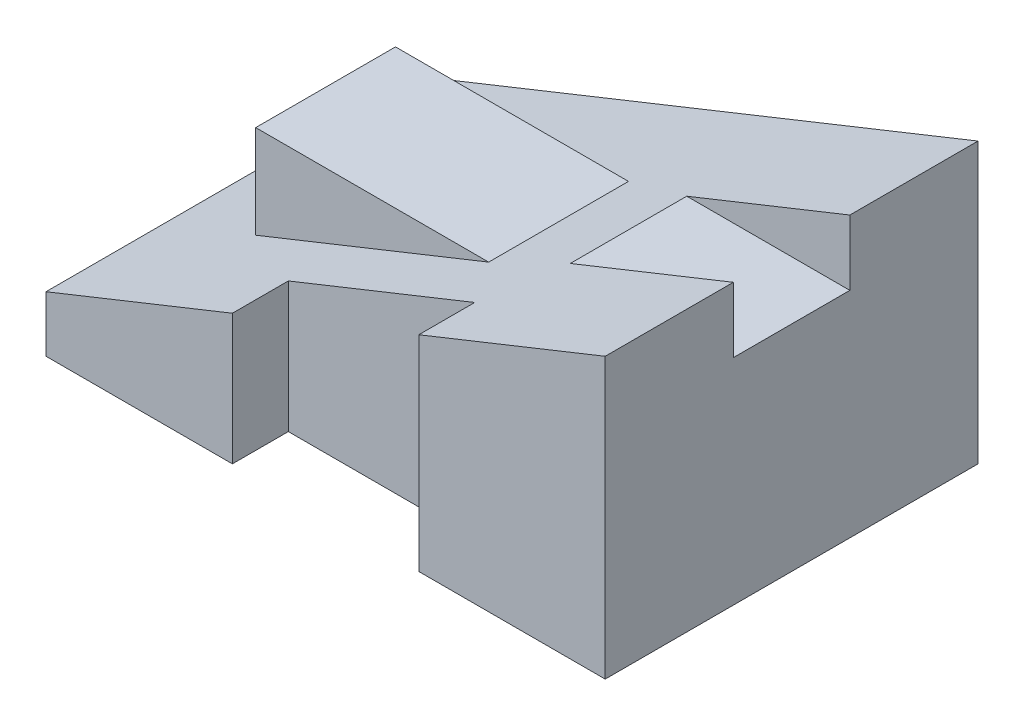
ISO-10303-21;
HEADER;
FILE_DESCRIPTION(('STEP AP214'),'2;1');
FILE_NAME('part.step','',(''),(''),'','','');
FILE_SCHEMA(('AUTOMOTIVE_DESIGN { 1 0 10303 214 1 1 1 1 }'));
ENDSEC;
DATA;
#1=APPLICATION_CONTEXT('core data for automotive mechanical design processes');
#2=APPLICATION_PROTOCOL_DEFINITION('international standard','automotive_design',2000,#1);
#3=PRODUCT_CONTEXT('',#1,'mechanical');
#4=PRODUCT('Part','Part','',(#3));
#5=PRODUCT_RELATED_PRODUCT_CATEGORY('part','',(#4));
#6=PRODUCT_DEFINITION_FORMATION('','',#4);
#7=PRODUCT_DEFINITION_CONTEXT('part definition',#1,'design');
#8=PRODUCT_DEFINITION('design','',#6,#7);
#9=PRODUCT_DEFINITION_SHAPE('','',#8);
#10=(LENGTH_UNIT() NAMED_UNIT(*) SI_UNIT(.MILLI.,.METRE.));
#11=(NAMED_UNIT(*) PLANE_ANGLE_UNIT() SI_UNIT($,.RADIAN.));
#12=(NAMED_UNIT(*) SI_UNIT($,.STERADIAN.) SOLID_ANGLE_UNIT());
#13=UNCERTAINTY_MEASURE_WITH_UNIT(LENGTH_MEASURE(1.E-05),#10,'distance_accuracy_value','');
#14=(GEOMETRIC_REPRESENTATION_CONTEXT(3) GLOBAL_UNCERTAINTY_ASSIGNED_CONTEXT((#13)) GLOBAL_UNIT_ASSIGNED_CONTEXT((#10,
#11,#12)) REPRESENTATION_CONTEXT('',''));
#15=CARTESIAN_POINT('',(0.,0.,0.));
#16=DIRECTION('',(0.,0.,1.));
#17=DIRECTION('',(1.,0.,0.));
#18=AXIS2_PLACEMENT_3D('',#15,#16,#17);
#19=CARTESIAN_POINT('',(60.,60.,-40.));
#20=DIRECTION('',(0.371390676354104,-0.928476690885259,0.));
#21=DIRECTION('',(0.928476690885259,0.371390676354104,0.));
#22=AXIS2_PLACEMENT_3D('',#19,#20,#21);
#23=PLANE('',#22);
#24=DIRECTION('',(0.,0.,1.));
#25=VECTOR('',#24,1.);
#26=CARTESIAN_POINT('',(-40.,20.,-40.));
#27=LINE('',#26,#25);
#28=CARTESIAN_POINT('',(-40.,20.,-15.));
#29=VERTEX_POINT('',#28);
#30=CARTESIAN_POINT('',(-40.,20.,15.));
#31=VERTEX_POINT('',#30);
#32=EDGE_CURVE('E245',#29,#31,#27,.T.);
#33=ORIENTED_EDGE('',*,*,#32,.F.);
#34=DIRECTION('',(-0.928476690885259,-0.371390676354104,0.));
#35=VECTOR('',#34,1.);
#36=CARTESIAN_POINT('',(60.,60.,-15.));
#37=LINE('',#36,#35);
#38=CARTESIAN_POINT('',(9.99999999999999,40.,-15.));
#39=VERTEX_POINT('',#38);
#40=EDGE_CURVE('E236',#39,#29,#37,.T.);
#41=ORIENTED_EDGE('',*,*,#40,.F.);
#42=DIRECTION('',(0.,0.,1.));
#43=VECTOR('',#42,1.);
#44=CARTESIAN_POINT('',(9.99999999999999,40.,-40.));
#45=LINE('',#44,#43);
#46=CARTESIAN_POINT('',(9.99999999999999,40.,15.));
#47=VERTEX_POINT('',#46);
#48=EDGE_CURVE('E231',#39,#47,#45,.T.);
#49=ORIENTED_EDGE('',*,*,#48,.T.);
#50=DIRECTION('',(0.928476690885259,0.371390676354104,0.));
#51=VECTOR('',#50,1.);
#52=CARTESIAN_POINT('',(60.,60.,15.));
#53=LINE('',#52,#51);
#54=EDGE_CURVE('E238',#31,#47,#53,.T.);
#55=ORIENTED_EDGE('',*,*,#54,.F.);
#56=EDGE_LOOP('',(#33,#41,#49,#55));
#57=FACE_BOUND('',#56,.T.);
#58=DIRECTION('',(0.928476690885259,0.371390676354104,0.));
#59=VECTOR('',#58,1.);
#60=CARTESIAN_POINT('',(60.,60.,12.5));
#61=LINE('',#60,#59);
#62=CARTESIAN_POINT('',(25.,46.,12.5));
#63=VERTEX_POINT('',#62);
#64=CARTESIAN_POINT('',(60.,60.,12.5));
#65=VERTEX_POINT('',#64);
#66=EDGE_CURVE('E11',#63,#65,#61,.T.);
#67=ORIENTED_EDGE('',*,*,#66,.F.);
#68=DIRECTION('',(0.,0.,1.));
#69=VECTOR('',#68,1.);
#70=CARTESIAN_POINT('',(24.9999999999999,46.,-39.9999999999999));
#71=LINE('',#70,#69);
#72=CARTESIAN_POINT('',(25.,46.,-12.5));
#73=VERTEX_POINT('',#72);
#74=EDGE_CURVE('E161',#73,#63,#71,.T.);
#75=ORIENTED_EDGE('',*,*,#74,.F.);
#76=DIRECTION('',(-0.928476690885259,-0.371390676354104,0.));
#77=VECTOR('',#76,1.);
#78=CARTESIAN_POINT('',(60.,60.,-12.5));
#79=LINE('',#78,#77);
#80=CARTESIAN_POINT('',(60.,60.,-12.5));
#81=VERTEX_POINT('',#80);
#82=EDGE_CURVE('E50',#81,#73,#79,.T.);
#83=ORIENTED_EDGE('',*,*,#82,.F.);
#84=DIRECTION('',(0.,0.,-1.));
#85=VECTOR('',#84,1.);
#86=CARTESIAN_POINT('',(60.,60.,-40.));
#87=LINE('',#86,#85);
#88=CARTESIAN_POINT('',(60.,60.,-40.));
#89=VERTEX_POINT('',#88);
#90=EDGE_CURVE('E156',#81,#89,#87,.T.);
#91=ORIENTED_EDGE('',*,*,#90,.T.);
#92=DIRECTION('',(0.92847669088526,0.371390676354104,0.));
#93=VECTOR('',#92,1.);
#94=CARTESIAN_POINT('',(60.,60.,-40.));
#95=LINE('',#94,#93);
#96=CARTESIAN_POINT('',(-60.,12.,-40.));
#97=VERTEX_POINT('',#96);
#98=EDGE_CURVE('E173',#97,#89,#95,.T.);
#99=ORIENTED_EDGE('',*,*,#98,.F.);
#100=DIRECTION('',(0.,0.,1.));
#101=VECTOR('',#100,1.);
#102=CARTESIAN_POINT('',(-60.,12.,-40.));
#103=LINE('',#102,#101);
#104=CARTESIAN_POINT('',(-60.,12.,40.));
#105=VERTEX_POINT('',#104);
#106=EDGE_CURVE('E178',#97,#105,#103,.T.);
#107=ORIENTED_EDGE('',*,*,#106,.T.);
#108=DIRECTION('',(0.92847669088526,0.371390676354104,0.));
#109=VECTOR('',#108,1.);
#110=CARTESIAN_POINT('',(60.,60.,40.));
#111=LINE('',#110,#109);
#112=CARTESIAN_POINT('',(-20.,28.,40.));
#113=VERTEX_POINT('',#112);
#114=EDGE_CURVE('E179',#105,#113,#111,.T.);
#115=ORIENTED_EDGE('',*,*,#114,.T.);
#116=DIRECTION('',(0.,0.,1.));
#117=VECTOR('',#116,1.);
#118=CARTESIAN_POINT('',(-20.,28.,28.));
#119=LINE('',#118,#117);
#120=CARTESIAN_POINT('',(-20.,28.,28.));
#121=VERTEX_POINT('',#120);
#122=EDGE_CURVE('E183',#121,#113,#119,.T.);
#123=ORIENTED_EDGE('',*,*,#122,.F.);
#124=DIRECTION('',(-0.928476690885259,-0.371390676354104,0.));
#125=VECTOR('',#124,1.);
#126=CARTESIAN_POINT('',(-8.96551724137929,32.4137931034483,28.));
#127=LINE('',#126,#125);
#128=CARTESIAN_POINT('',(20.,44.,28.));
#129=VERTEX_POINT('',#128);
#130=EDGE_CURVE('E185',#129,#121,#127,.T.);
#131=ORIENTED_EDGE('',*,*,#130,.F.);
#132=DIRECTION('',(0.,0.,-1.));
#133=VECTOR('',#132,1.);
#134=CARTESIAN_POINT('',(20.,44.,28.));
#135=LINE('',#134,#133);
#136=CARTESIAN_POINT('',(20.,44.,40.));
#137=VERTEX_POINT('',#136);
#138=EDGE_CURVE('E235',#137,#129,#135,.T.);
#139=ORIENTED_EDGE('',*,*,#138,.F.);
#140=CARTESIAN_POINT('',(60.,60.,40.));
#141=VERTEX_POINT('',#140);
#142=EDGE_CURVE('E171',#137,#141,#111,.T.);
#143=ORIENTED_EDGE('',*,*,#142,.T.);
#144=EDGE_CURVE('E186',#141,#65,#87,.T.);
#145=ORIENTED_EDGE('',*,*,#144,.T.);
#146=EDGE_LOOP('',(#67,#75,#83,#91,#99,#107,#115,#123,#131,#139,#143,#145));
#147=FACE_BOUND('',#146,.T.);
#148=ADVANCED_FACE('F39',(#57,#147),#23,.F.);
#149=CARTESIAN_POINT('',(60.,60.,-40.));
#150=DIRECTION('',(-1.,0.,0.));
#151=DIRECTION('',(0.,0.,1.));
#152=AXIS2_PLACEMENT_3D('',#149,#150,#151);
#153=PLANE('',#152);
#154=DIRECTION('',(0.,-1.,0.));
#155=VECTOR('',#154,1.);
#156=CARTESIAN_POINT('',(60.,60.,12.5));
#157=LINE('',#156,#155);
#158=CARTESIAN_POINT('',(60.,46.,12.5));
#159=VERTEX_POINT('',#158);
#160=EDGE_CURVE('E150',#65,#159,#157,.T.);
#161=ORIENTED_EDGE('',*,*,#160,.F.);
#162=ORIENTED_EDGE('',*,*,#144,.F.);
#163=DIRECTION('',(0.,-1.,0.));
#164=VECTOR('',#163,1.);
#165=CARTESIAN_POINT('',(60.,60.,40.));
#166=LINE('',#165,#164);
#167=CARTESIAN_POINT('',(60.,0.,40.));
#168=VERTEX_POINT('',#167);
#169=EDGE_CURVE('E226',#141,#168,#166,.T.);
#170=ORIENTED_EDGE('',*,*,#169,.T.);
#171=DIRECTION('',(0.,0.,-1.));
#172=VECTOR('',#171,1.);
#173=CARTESIAN_POINT('',(60.,0.,-40.));
#174=LINE('',#173,#172);
#175=CARTESIAN_POINT('',(60.,0.,-40.));
#176=VERTEX_POINT('',#175);
#177=EDGE_CURVE('E191',#168,#176,#174,.T.);
#178=ORIENTED_EDGE('',*,*,#177,.T.);
#179=DIRECTION('',(0.,-1.,0.));
#180=VECTOR('',#179,1.);
#181=CARTESIAN_POINT('',(60.,60.,-40.));
#182=LINE('',#181,#180);
#183=EDGE_CURVE('E227',#89,#176,#182,.T.);
#184=ORIENTED_EDGE('',*,*,#183,.F.);
#185=ORIENTED_EDGE('',*,*,#90,.F.);
#186=DIRECTION('',(0.,1.,0.));
#187=VECTOR('',#186,1.);
#188=CARTESIAN_POINT('',(60.,60.,-12.5));
#189=LINE('',#188,#187);
#190=CARTESIAN_POINT('',(60.,46.,-12.5));
#191=VERTEX_POINT('',#190);
#192=EDGE_CURVE('E148',#191,#81,#189,.T.);
#193=ORIENTED_EDGE('',*,*,#192,.F.);
#194=DIRECTION('',(0.,0.,-1.));
#195=VECTOR('',#194,1.);
#196=CARTESIAN_POINT('',(60.,46.,-12.5));
#197=LINE('',#196,#195);
#198=EDGE_CURVE('E138',#159,#191,#197,.T.);
#199=ORIENTED_EDGE('',*,*,#198,.F.);
#200=EDGE_LOOP('',(#161,#162,#170,#178,#184,#185,#193,#199));
#201=FACE_BOUND('',#200,.T.);
#202=ADVANCED_FACE('F152',(#201),#153,.F.);
#203=CARTESIAN_POINT('',(20.,60.,40.));
#204=DIRECTION('',(0.,0.,-1.));
#205=DIRECTION('',(-1.,0.,0.));
#206=AXIS2_PLACEMENT_3D('',#203,#204,#205);
#207=PLANE('',#206);
#208=ORIENTED_EDGE('',*,*,#142,.F.);
#209=DIRECTION('',(0.,-1.,0.));
#210=VECTOR('',#209,1.);
#211=CARTESIAN_POINT('',(20.,60.,40.));
#212=LINE('',#211,#210);
#213=CARTESIAN_POINT('',(20.,0.,40.));
#214=VERTEX_POINT('',#213);
#215=EDGE_CURVE('E195',#137,#214,#212,.T.);
#216=ORIENTED_EDGE('',*,*,#215,.T.);
#217=DIRECTION('',(1.,0.,0.));
#218=VECTOR('',#217,1.);
#219=CARTESIAN_POINT('',(20.,0.,40.));
#220=LINE('',#219,#218);
#221=EDGE_CURVE('E189',#214,#168,#220,.T.);
#222=ORIENTED_EDGE('',*,*,#221,.T.);
#223=ORIENTED_EDGE('',*,*,#169,.F.);
#224=EDGE_LOOP('',(#208,#216,#222,#223));
#225=FACE_BOUND('',#224,.T.);
#226=ADVANCED_FACE('F41',(#225),#207,.F.);
#227=CARTESIAN_POINT('',(-60.,60.,-40.));
#228=DIRECTION('',(1.,0.,0.));
#229=DIRECTION('',(0.,0.,-1.));
#230=AXIS2_PLACEMENT_3D('',#227,#228,#229);
#231=PLANE('',#230);
#232=ORIENTED_EDGE('',*,*,#106,.F.);
#233=DIRECTION('',(0.,-1.,0.));
#234=VECTOR('',#233,1.);
#235=CARTESIAN_POINT('',(-60.,60.,-40.));
#236=LINE('',#235,#234);
#237=CARTESIAN_POINT('',(-60.,0.,-40.));
#238=VERTEX_POINT('',#237);
#239=EDGE_CURVE('E221',#97,#238,#236,.T.);
#240=ORIENTED_EDGE('',*,*,#239,.T.);
#241=DIRECTION('',(0.,0.,1.));
#242=VECTOR('',#241,1.);
#243=CARTESIAN_POINT('',(-60.,0.,-40.));
#244=LINE('',#243,#242);
#245=CARTESIAN_POINT('',(-60.,0.,40.));
#246=VERTEX_POINT('',#245);
#247=EDGE_CURVE('E199',#238,#246,#244,.T.);
#248=ORIENTED_EDGE('',*,*,#247,.T.);
#249=DIRECTION('',(0.,-1.,0.));
#250=VECTOR('',#249,1.);
#251=CARTESIAN_POINT('',(-60.,60.,40.));
#252=LINE('',#251,#250);
#253=EDGE_CURVE('E225',#105,#246,#252,.T.);
#254=ORIENTED_EDGE('',*,*,#253,.F.);
#255=EDGE_LOOP('',(#232,#240,#248,#254));
#256=FACE_BOUND('',#255,.T.);
#257=ADVANCED_FACE('F293',(#256),#231,.F.);
#258=CARTESIAN_POINT('',(-60.,60.,40.));
#259=DIRECTION('',(0.,0.,-1.));
#260=DIRECTION('',(-1.,0.,0.));
#261=AXIS2_PLACEMENT_3D('',#258,#259,#260);
#262=PLANE('',#261);
#263=ORIENTED_EDGE('',*,*,#114,.F.);
#264=ORIENTED_EDGE('',*,*,#253,.T.);
#265=DIRECTION('',(1.,0.,0.));
#266=VECTOR('',#265,1.);
#267=CARTESIAN_POINT('',(-60.,0.,40.));
#268=LINE('',#267,#266);
#269=CARTESIAN_POINT('',(-20.,0.,40.));
#270=VERTEX_POINT('',#269);
#271=EDGE_CURVE('E201',#246,#270,#268,.T.);
#272=ORIENTED_EDGE('',*,*,#271,.T.);
#273=DIRECTION('',(0.,-1.,0.));
#274=VECTOR('',#273,1.);
#275=CARTESIAN_POINT('',(-20.,60.,40.));
#276=LINE('',#275,#274);
#277=EDGE_CURVE('E219',#113,#270,#276,.T.);
#278=ORIENTED_EDGE('',*,*,#277,.F.);
#279=EDGE_LOOP('',(#263,#264,#272,#278));
#280=FACE_BOUND('',#279,.T.);
#281=ADVANCED_FACE('F295',(#280),#262,.F.);
#282=CARTESIAN_POINT('',(-60.,60.,-40.));
#283=DIRECTION('',(0.,0.,1.));
#284=DIRECTION('',(1.,0.,0.));
#285=AXIS2_PLACEMENT_3D('',#282,#283,#284);
#286=PLANE('',#285);
#287=ORIENTED_EDGE('',*,*,#239,.F.);
#288=ORIENTED_EDGE('',*,*,#98,.T.);
#289=ORIENTED_EDGE('',*,*,#183,.T.);
#290=DIRECTION('',(-1.,0.,0.));
#291=VECTOR('',#290,1.);
#292=CARTESIAN_POINT('',(-60.,0.,-40.));
#293=LINE('',#292,#291);
#294=EDGE_CURVE('E197',#176,#238,#293,.T.);
#295=ORIENTED_EDGE('',*,*,#294,.T.);
#296=EDGE_LOOP('',(#287,#288,#289,#295));
#297=FACE_BOUND('',#296,.T.);
#298=ADVANCED_FACE('F286',(#297),#286,.F.);
#299=CARTESIAN_POINT('',(-20.,60.,28.));
#300=DIRECTION('',(-1.,0.,0.));
#301=DIRECTION('',(0.,0.,1.));
#302=AXIS2_PLACEMENT_3D('',#299,#300,#301);
#303=PLANE('',#302);
#304=DIRECTION('',(0.,-1.,0.));
#305=VECTOR('',#304,1.);
#306=CARTESIAN_POINT('',(-20.,60.,28.));
#307=LINE('',#306,#305);
#308=CARTESIAN_POINT('',(-20.,0.,28.));
#309=VERTEX_POINT('',#308);
#310=EDGE_CURVE('E217',#121,#309,#307,.T.);
#311=ORIENTED_EDGE('',*,*,#310,.F.);
#312=ORIENTED_EDGE('',*,*,#122,.T.);
#313=ORIENTED_EDGE('',*,*,#277,.T.);
#314=DIRECTION('',(0.,0.,-1.));
#315=VECTOR('',#314,1.);
#316=CARTESIAN_POINT('',(-20.,0.,28.));
#317=LINE('',#316,#315);
#318=EDGE_CURVE('E206',#270,#309,#317,.T.);
#319=ORIENTED_EDGE('',*,*,#318,.T.);
#320=EDGE_LOOP('',(#311,#312,#313,#319));
#321=FACE_BOUND('',#320,.T.);
#322=ADVANCED_FACE('F287',(#321),#303,.F.);
#323=CARTESIAN_POINT('',(-20.,60.,28.));
#324=DIRECTION('',(0.,0.,-1.));
#325=DIRECTION('',(-1.,0.,0.));
#326=AXIS2_PLACEMENT_3D('',#323,#324,#325);
#327=PLANE('',#326);
#328=DIRECTION('',(0.,-1.,0.));
#329=VECTOR('',#328,1.);
#330=CARTESIAN_POINT('',(20.,60.,28.));
#331=LINE('',#330,#329);
#332=CARTESIAN_POINT('',(20.,0.,28.));
#333=VERTEX_POINT('',#332);
#334=EDGE_CURVE('E216',#129,#333,#331,.T.);
#335=ORIENTED_EDGE('',*,*,#334,.F.);
#336=ORIENTED_EDGE('',*,*,#130,.T.);
#337=ORIENTED_EDGE('',*,*,#310,.T.);
#338=DIRECTION('',(1.,0.,0.));
#339=VECTOR('',#338,1.);
#340=CARTESIAN_POINT('',(-20.,0.,28.));
#341=LINE('',#340,#339);
#342=EDGE_CURVE('E207',#309,#333,#341,.T.);
#343=ORIENTED_EDGE('',*,*,#342,.T.);
#344=EDGE_LOOP('',(#335,#336,#337,#343));
#345=FACE_BOUND('',#344,.T.);
#346=ADVANCED_FACE('F285',(#345),#327,.F.);
#347=CARTESIAN_POINT('',(20.,60.,28.));
#348=DIRECTION('',(1.,0.,0.));
#349=DIRECTION('',(0.,0.,-1.));
#350=AXIS2_PLACEMENT_3D('',#347,#348,#349);
#351=PLANE('',#350);
#352=ORIENTED_EDGE('',*,*,#215,.F.);
#353=ORIENTED_EDGE('',*,*,#138,.T.);
#354=ORIENTED_EDGE('',*,*,#334,.T.);
#355=DIRECTION('',(0.,0.,1.));
#356=VECTOR('',#355,1.);
#357=CARTESIAN_POINT('',(20.,0.,28.));
#358=LINE('',#357,#356);
#359=EDGE_CURVE('E215',#333,#214,#358,.T.);
#360=ORIENTED_EDGE('',*,*,#359,.T.);
#361=EDGE_LOOP('',(#352,#353,#354,#360));
#362=FACE_BOUND('',#361,.T.);
#363=ADVANCED_FACE('F279',(#362),#351,.F.);
#364=CARTESIAN_POINT('',(0.,0.,0.));
#365=DIRECTION('',(0.,-1.,0.));
#366=DIRECTION('',(0.,0.,-1.));
#367=AXIS2_PLACEMENT_3D('',#364,#365,#366);
#368=PLANE('',#367);
#369=ORIENTED_EDGE('',*,*,#294,.F.);
#370=ORIENTED_EDGE('',*,*,#177,.F.);
#371=ORIENTED_EDGE('',*,*,#221,.F.);
#372=ORIENTED_EDGE('',*,*,#359,.F.);
#373=ORIENTED_EDGE('',*,*,#342,.F.);
#374=ORIENTED_EDGE('',*,*,#318,.F.);
#375=ORIENTED_EDGE('',*,*,#271,.F.);
#376=ORIENTED_EDGE('',*,*,#247,.F.);
#377=EDGE_LOOP('',(#369,#370,#371,#372,#373,#374,#375,#376));
#378=FACE_BOUND('',#377,.T.);
#379=ADVANCED_FACE('F274',(#378),#368,.T.);
#380=CARTESIAN_POINT('',(-40.,40.,-15.));
#381=DIRECTION('',(1.,0.,0.));
#382=DIRECTION('',(0.,0.,-1.));
#383=AXIS2_PLACEMENT_3D('',#380,#381,#382);
#384=PLANE('',#383);
#385=DIRECTION('',(0.,-1.,0.));
#386=VECTOR('',#385,1.);
#387=CARTESIAN_POINT('',(-40.,40.,-15.));
#388=LINE('',#387,#386);
#389=CARTESIAN_POINT('',(-40.,40.,-15.));
#390=VERTEX_POINT('',#389);
#391=EDGE_CURVE('E169',#390,#29,#388,.T.);
#392=ORIENTED_EDGE('',*,*,#391,.T.);
#393=ORIENTED_EDGE('',*,*,#32,.T.);
#394=DIRECTION('',(0.,-1.,0.));
#395=VECTOR('',#394,1.);
#396=CARTESIAN_POINT('',(-40.,40.,15.));
#397=LINE('',#396,#395);
#398=CARTESIAN_POINT('',(-40.,40.,15.));
#399=VERTEX_POINT('',#398);
#400=EDGE_CURVE('E172',#399,#31,#397,.T.);
#401=ORIENTED_EDGE('',*,*,#400,.F.);
#402=DIRECTION('',(0.,0.,1.));
#403=VECTOR('',#402,1.);
#404=CARTESIAN_POINT('',(-40.,40.,-15.));
#405=LINE('',#404,#403);
#406=EDGE_CURVE('E162',#390,#399,#405,.T.);
#407=ORIENTED_EDGE('',*,*,#406,.F.);
#408=EDGE_LOOP('',(#392,#393,#401,#407));
#409=FACE_BOUND('',#408,.T.);
#410=ADVANCED_FACE('F247',(#409),#384,.F.);
#411=CARTESIAN_POINT('',(-40.,40.,15.));
#412=DIRECTION('',(0.,0.,-1.));
#413=DIRECTION('',(-1.,0.,0.));
#414=AXIS2_PLACEMENT_3D('',#411,#412,#413);
#415=PLANE('',#414);
#416=ORIENTED_EDGE('',*,*,#400,.T.);
#417=ORIENTED_EDGE('',*,*,#54,.T.);
#418=DIRECTION('',(1.,0.,0.));
#419=VECTOR('',#418,1.);
#420=CARTESIAN_POINT('',(-40.,40.,15.));
#421=LINE('',#420,#419);
#422=EDGE_CURVE('E65',#399,#47,#421,.T.);
#423=ORIENTED_EDGE('',*,*,#422,.F.);
#424=EDGE_LOOP('',(#416,#417,#423));
#425=FACE_BOUND('',#424,.T.);
#426=ADVANCED_FACE('F251',(#425),#415,.F.);
#427=CARTESIAN_POINT('',(-40.,40.,-15.));
#428=DIRECTION('',(0.,0.,1.));
#429=DIRECTION('',(1.,0.,0.));
#430=AXIS2_PLACEMENT_3D('',#427,#428,#429);
#431=PLANE('',#430);
#432=DIRECTION('',(-1.,0.,0.));
#433=VECTOR('',#432,1.);
#434=CARTESIAN_POINT('',(-40.,40.,-15.));
#435=LINE('',#434,#433);
#436=EDGE_CURVE('E167',#39,#390,#435,.T.);
#437=ORIENTED_EDGE('',*,*,#436,.F.);
#438=ORIENTED_EDGE('',*,*,#40,.T.);
#439=ORIENTED_EDGE('',*,*,#391,.F.);
#440=EDGE_LOOP('',(#437,#438,#439));
#441=FACE_BOUND('',#440,.T.);
#442=ADVANCED_FACE('F256',(#441),#431,.F.);
#443=CARTESIAN_POINT('',(0.,40.,0.));
#444=DIRECTION('',(0.,1.,0.));
#445=DIRECTION('',(0.,0.,1.));
#446=AXIS2_PLACEMENT_3D('',#443,#444,#445);
#447=PLANE('',#446);
#448=ORIENTED_EDGE('',*,*,#48,.F.);
#449=ORIENTED_EDGE('',*,*,#436,.T.);
#450=ORIENTED_EDGE('',*,*,#406,.T.);
#451=ORIENTED_EDGE('',*,*,#422,.T.);
#452=EDGE_LOOP('',(#448,#449,#450,#451));
#453=FACE_BOUND('',#452,.T.);
#454=ADVANCED_FACE('F258',(#453),#447,.T.);
#455=CARTESIAN_POINT('',(60.,60.,12.5));
#456=DIRECTION('',(0.,0.,-1.));
#457=DIRECTION('',(0.,1.,0.));
#458=AXIS2_PLACEMENT_3D('',#455,#456,#457);
#459=PLANE('',#458);
#460=ORIENTED_EDGE('',*,*,#66,.T.);
#461=ORIENTED_EDGE('',*,*,#160,.T.);
#462=DIRECTION('',(-1.,0.,0.));
#463=VECTOR('',#462,1.);
#464=CARTESIAN_POINT('',(60.,46.,12.5));
#465=LINE('',#464,#463);
#466=EDGE_CURVE('E53',#159,#63,#465,.T.);
#467=ORIENTED_EDGE('',*,*,#466,.T.);
#468=EDGE_LOOP('',(#460,#461,#467));
#469=FACE_BOUND('',#468,.T.);
#470=ADVANCED_FACE('F264',(#469),#459,.T.);
#471=CARTESIAN_POINT('',(60.,60.,-12.5));
#472=DIRECTION('',(0.,0.,1.));
#473=DIRECTION('',(1.,0.,0.));
#474=AXIS2_PLACEMENT_3D('',#471,#472,#473);
#475=PLANE('',#474);
#476=ORIENTED_EDGE('',*,*,#82,.T.);
#477=DIRECTION('',(-1.,0.,0.));
#478=VECTOR('',#477,1.);
#479=CARTESIAN_POINT('',(60.,46.,-12.5));
#480=LINE('',#479,#478);
#481=EDGE_CURVE('E143',#191,#73,#480,.T.);
#482=ORIENTED_EDGE('',*,*,#481,.F.);
#483=ORIENTED_EDGE('',*,*,#192,.T.);
#484=EDGE_LOOP('',(#476,#482,#483));
#485=FACE_BOUND('',#484,.T.);
#486=ADVANCED_FACE('F147',(#485),#475,.T.);
#487=CARTESIAN_POINT('',(60.,46.,-12.5));
#488=DIRECTION('',(0.,1.,0.));
#489=DIRECTION('',(0.,0.,1.));
#490=AXIS2_PLACEMENT_3D('',#487,#488,#489);
#491=PLANE('',#490);
#492=ORIENTED_EDGE('',*,*,#74,.T.);
#493=ORIENTED_EDGE('',*,*,#466,.F.);
#494=ORIENTED_EDGE('',*,*,#198,.T.);
#495=ORIENTED_EDGE('',*,*,#481,.T.);
#496=EDGE_LOOP('',(#492,#493,#494,#495));
#497=FACE_BOUND('',#496,.T.);
#498=ADVANCED_FACE('F136',(#497),#491,.T.);
#499=CLOSED_SHELL('',(#148,#202,#226,#257,#281,#298,#322,#346,#363,#379,#410,#426,#442,#454,
#470,#486,#498));
#500=MANIFOLD_SOLID_BREP('B2',#499);
#501=ADVANCED_BREP_SHAPE_REPRESENTATION('',(#18,#500),#14);
#502=SHAPE_DEFINITION_REPRESENTATION(#9,#501);
ENDSEC;
END-ISO-10303-21;
